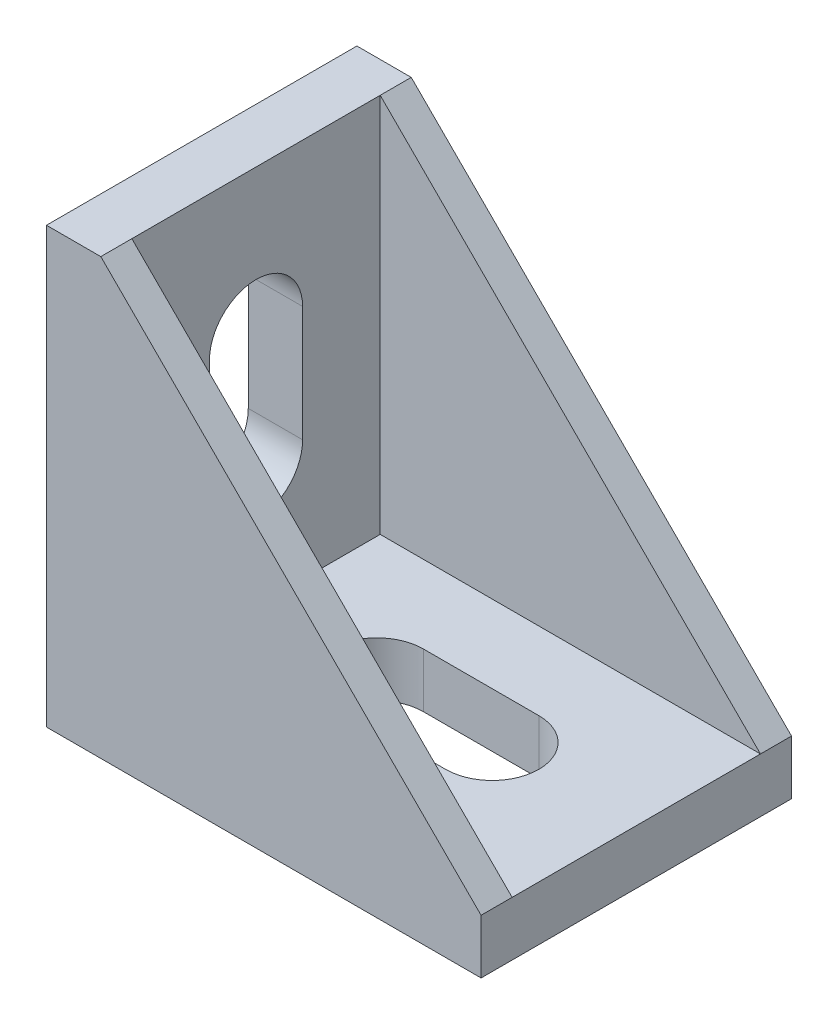
ISO-10303-21;
HEADER;
FILE_DESCRIPTION(('STEP AP214'),'2;1');
FILE_NAME('part.step','',(''),(''),'','','');
FILE_SCHEMA(('AUTOMOTIVE_DESIGN { 1 0 10303 214 1 1 1 1 }'));
ENDSEC;
DATA;
#1=APPLICATION_CONTEXT('core data for automotive mechanical design processes');
#2=APPLICATION_PROTOCOL_DEFINITION('international standard','automotive_design',2000,#1);
#3=PRODUCT_CONTEXT('',#1,'mechanical');
#4=PRODUCT('Part','Part','',(#3));
#5=PRODUCT_RELATED_PRODUCT_CATEGORY('part','',(#4));
#6=PRODUCT_DEFINITION_FORMATION('','',#4);
#7=PRODUCT_DEFINITION_CONTEXT('part definition',#1,'design');
#8=PRODUCT_DEFINITION('design','',#6,#7);
#9=PRODUCT_DEFINITION_SHAPE('','',#8);
#10=(LENGTH_UNIT() NAMED_UNIT(*) SI_UNIT(.MILLI.,.METRE.));
#11=(NAMED_UNIT(*) PLANE_ANGLE_UNIT() SI_UNIT($,.RADIAN.));
#12=(NAMED_UNIT(*) SI_UNIT($,.STERADIAN.) SOLID_ANGLE_UNIT());
#13=UNCERTAINTY_MEASURE_WITH_UNIT(LENGTH_MEASURE(1.E-05),#10,'distance_accuracy_value','');
#14=(GEOMETRIC_REPRESENTATION_CONTEXT(3) GLOBAL_UNCERTAINTY_ASSIGNED_CONTEXT((#13)) GLOBAL_UNIT_ASSIGNED_CONTEXT((#10,
#11,#12)) REPRESENTATION_CONTEXT('',''));
#15=CARTESIAN_POINT('',(0.,0.,0.));
#16=DIRECTION('',(0.,0.,1.));
#17=DIRECTION('',(1.,0.,0.));
#18=AXIS2_PLACEMENT_3D('',#15,#16,#17);
#19=CARTESIAN_POINT('',(3.5,0.,0.));
#20=DIRECTION('',(-1.,0.,0.));
#21=DIRECTION('',(0.,0.,1.));
#22=AXIS2_PLACEMENT_3D('',#19,#20,#21);
#23=PLANE('',#22);
#24=DIRECTION('',(0.,1.,0.));
#25=VECTOR('',#24,1.);
#26=CARTESIAN_POINT('',(3.5,11.28,-13.));
#27=LINE('',#26,#25);
#28=CARTESIAN_POINT('',(3.5,11.28,-13.));
#29=VERTEX_POINT('',#28);
#30=CARTESIAN_POINT('',(3.5,18.72,-13.));
#31=VERTEX_POINT('',#30);
#32=EDGE_CURVE('E173',#29,#31,#27,.T.);
#33=ORIENTED_EDGE('',*,*,#32,.F.);
#34=CARTESIAN_POINT('',(3.5,11.28,-10.));
#35=DIRECTION('',(1.,0.,0.));
#36=DIRECTION('',(0.,0.,-1.));
#37=AXIS2_PLACEMENT_3D('',#34,#35,#36);
#38=CIRCLE('',#37,3.);
#39=CARTESIAN_POINT('',(3.5,11.28,-7.));
#40=VERTEX_POINT('',#39);
#41=EDGE_CURVE('E48',#40,#29,#38,.T.);
#42=ORIENTED_EDGE('',*,*,#41,.F.);
#43=DIRECTION('',(0.,-1.,0.));
#44=VECTOR('',#43,1.);
#45=CARTESIAN_POINT('',(3.5,11.28,-7.));
#46=LINE('',#45,#44);
#47=CARTESIAN_POINT('',(3.5,18.72,-7.));
#48=VERTEX_POINT('',#47);
#49=EDGE_CURVE('E164',#48,#40,#46,.T.);
#50=ORIENTED_EDGE('',*,*,#49,.F.);
#51=CARTESIAN_POINT('',(3.5,18.72,-10.));
#52=DIRECTION('',(1.,0.,0.));
#53=DIRECTION('',(0.,0.,-1.));
#54=AXIS2_PLACEMENT_3D('',#51,#52,#53);
#55=CIRCLE('',#54,3.);
#56=EDGE_CURVE('E167',#31,#48,#55,.T.);
#57=ORIENTED_EDGE('',*,*,#56,.F.);
#58=EDGE_LOOP('',(#33,#42,#50,#57));
#59=FACE_BOUND('',#58,.T.);
#60=DIRECTION('',(0.,1.,0.));
#61=VECTOR('',#60,1.);
#62=CARTESIAN_POINT('',(3.5,0.,-2.));
#63=LINE('',#62,#61);
#64=CARTESIAN_POINT('',(3.5,3.5,-2.));
#65=VERTEX_POINT('',#64);
#66=CARTESIAN_POINT('',(3.5,28.,-2.));
#67=VERTEX_POINT('',#66);
#68=EDGE_CURVE('E227',#65,#67,#63,.T.);
#69=ORIENTED_EDGE('',*,*,#68,.F.);
#70=DIRECTION('',(0.,0.,1.));
#71=VECTOR('',#70,1.);
#72=CARTESIAN_POINT('',(3.5,3.5,0.));
#73=LINE('',#72,#71);
#74=CARTESIAN_POINT('',(3.5,3.5,-18.));
#75=VERTEX_POINT('',#74);
#76=EDGE_CURVE('E240',#75,#65,#73,.T.);
#77=ORIENTED_EDGE('',*,*,#76,.F.);
#78=DIRECTION('',(0.,1.,0.));
#79=VECTOR('',#78,1.);
#80=CARTESIAN_POINT('',(3.5,0.,-18.));
#81=LINE('',#80,#79);
#82=CARTESIAN_POINT('',(3.5,28.,-18.));
#83=VERTEX_POINT('',#82);
#84=EDGE_CURVE('E237',#75,#83,#81,.T.);
#85=ORIENTED_EDGE('',*,*,#84,.T.);
#86=DIRECTION('',(0.,0.,1.));
#87=VECTOR('',#86,1.);
#88=CARTESIAN_POINT('',(3.5,28.,0.));
#89=LINE('',#88,#87);
#90=EDGE_CURVE('E259',#83,#67,#89,.T.);
#91=ORIENTED_EDGE('',*,*,#90,.T.);
#92=EDGE_LOOP('',(#69,#77,#85,#91));
#93=FACE_BOUND('',#92,.T.);
#94=ADVANCED_FACE('F33',(#59,#93),#23,.F.);
#95=CARTESIAN_POINT('',(28.,3.5,0.));
#96=DIRECTION('',(0.,-1.,0.));
#97=DIRECTION('',(0.,0.,-1.));
#98=AXIS2_PLACEMENT_3D('',#95,#96,#97);
#99=PLANE('',#98);
#100=DIRECTION('',(-1.,0.,0.));
#101=VECTOR('',#100,1.);
#102=CARTESIAN_POINT('',(18.7187827127262,3.5,-13.));
#103=LINE('',#102,#101);
#104=CARTESIAN_POINT('',(18.7187827127262,3.5,-13.));
#105=VERTEX_POINT('',#104);
#106=CARTESIAN_POINT('',(11.2812172872738,3.5,-13.));
#107=VERTEX_POINT('',#106);
#108=EDGE_CURVE('E198',#105,#107,#103,.T.);
#109=ORIENTED_EDGE('',*,*,#108,.F.);
#110=CARTESIAN_POINT('',(18.7187827127262,3.5,-10.));
#111=DIRECTION('',(0.,1.,0.));
#112=DIRECTION('',(0.,0.,1.));
#113=AXIS2_PLACEMENT_3D('',#110,#111,#112);
#114=CIRCLE('',#113,3.);
#115=CARTESIAN_POINT('',(18.7187827127262,3.5,-7.00000000000001));
#116=VERTEX_POINT('',#115);
#117=EDGE_CURVE('E179',#116,#105,#114,.T.);
#118=ORIENTED_EDGE('',*,*,#117,.F.);
#119=DIRECTION('',(1.,0.,0.));
#120=VECTOR('',#119,1.);
#121=CARTESIAN_POINT('',(18.7187827127262,3.5,-7.00000000000001));
#122=LINE('',#121,#120);
#123=CARTESIAN_POINT('',(11.2812172872738,3.5,-7.));
#124=VERTEX_POINT('',#123);
#125=EDGE_CURVE('E187',#124,#116,#122,.T.);
#126=ORIENTED_EDGE('',*,*,#125,.F.);
#127=CARTESIAN_POINT('',(11.2812172872738,3.5,-10.));
#128=DIRECTION('',(0.,1.,0.));
#129=DIRECTION('',(0.,0.,1.));
#130=AXIS2_PLACEMENT_3D('',#127,#128,#129);
#131=CIRCLE('',#130,3.);
#132=EDGE_CURVE('E201',#107,#124,#131,.T.);
#133=ORIENTED_EDGE('',*,*,#132,.F.);
#134=EDGE_LOOP('',(#109,#118,#126,#133));
#135=FACE_BOUND('',#134,.T.);
#136=DIRECTION('',(-1.,0.,0.));
#137=VECTOR('',#136,1.);
#138=CARTESIAN_POINT('',(28.,3.5,-2.));
#139=LINE('',#138,#137);
#140=CARTESIAN_POINT('',(28.,3.5,-2.));
#141=VERTEX_POINT('',#140);
#142=EDGE_CURVE('E223',#141,#65,#139,.T.);
#143=ORIENTED_EDGE('',*,*,#142,.F.);
#144=DIRECTION('',(0.,0.,1.));
#145=VECTOR('',#144,1.);
#146=CARTESIAN_POINT('',(28.,3.5,0.));
#147=LINE('',#146,#145);
#148=CARTESIAN_POINT('',(28.,3.5,-18.));
#149=VERTEX_POINT('',#148);
#150=EDGE_CURVE('E249',#149,#141,#147,.T.);
#151=ORIENTED_EDGE('',*,*,#150,.F.);
#152=DIRECTION('',(-1.,0.,0.));
#153=VECTOR('',#152,1.);
#154=CARTESIAN_POINT('',(28.,3.5,-18.));
#155=LINE('',#154,#153);
#156=EDGE_CURVE('E232',#149,#75,#155,.T.);
#157=ORIENTED_EDGE('',*,*,#156,.T.);
#158=ORIENTED_EDGE('',*,*,#76,.T.);
#159=EDGE_LOOP('',(#143,#151,#157,#158));
#160=FACE_BOUND('',#159,.T.);
#161=ADVANCED_FACE('F299',(#135,#160),#99,.F.);
#162=CARTESIAN_POINT('',(3.5,0.,0.));
#163=DIRECTION('',(0.,0.,-1.));
#164=DIRECTION('',(-1.,0.,0.));
#165=AXIS2_PLACEMENT_3D('',#162,#163,#164);
#166=PLANE('',#165);
#167=DIRECTION('',(0.,-1.,0.));
#168=VECTOR('',#167,1.);
#169=CARTESIAN_POINT('',(0.,0.,0.));
#170=LINE('',#169,#168);
#171=CARTESIAN_POINT('',(0.,28.,0.));
#172=VERTEX_POINT('',#171);
#173=CARTESIAN_POINT('',(0.,0.,0.));
#174=VERTEX_POINT('',#173);
#175=EDGE_CURVE('E253',#172,#174,#170,.T.);
#176=ORIENTED_EDGE('',*,*,#175,.T.);
#177=DIRECTION('',(-1.,0.,0.));
#178=VECTOR('',#177,1.);
#179=CARTESIAN_POINT('',(3.5,0.,0.));
#180=LINE('',#179,#178);
#181=CARTESIAN_POINT('',(28.,0.,0.));
#182=VERTEX_POINT('',#181);
#183=EDGE_CURVE('E11',#182,#174,#180,.T.);
#184=ORIENTED_EDGE('',*,*,#183,.F.);
#185=DIRECTION('',(0.,-1.,0.));
#186=VECTOR('',#185,1.);
#187=CARTESIAN_POINT('',(28.,0.,0.));
#188=LINE('',#187,#186);
#189=CARTESIAN_POINT('',(28.,3.5,0.));
#190=VERTEX_POINT('',#189);
#191=EDGE_CURVE('E241',#190,#182,#188,.T.);
#192=ORIENTED_EDGE('',*,*,#191,.F.);
#193=DIRECTION('',(-0.707106781186547,0.707106781186547,0.));
#194=VECTOR('',#193,1.);
#195=CARTESIAN_POINT('',(28.,3.5,0.));
#196=LINE('',#195,#194);
#197=CARTESIAN_POINT('',(3.5,28.,0.));
#198=VERTEX_POINT('',#197);
#199=EDGE_CURVE('E208',#190,#198,#196,.T.);
#200=ORIENTED_EDGE('',*,*,#199,.T.);
#201=DIRECTION('',(-1.,0.,0.));
#202=VECTOR('',#201,1.);
#203=CARTESIAN_POINT('',(3.5,28.,0.));
#204=LINE('',#203,#202);
#205=EDGE_CURVE('E258',#198,#172,#204,.T.);
#206=ORIENTED_EDGE('',*,*,#205,.T.);
#207=EDGE_LOOP('',(#176,#184,#192,#200,#206));
#208=FACE_BOUND('',#207,.T.);
#209=ADVANCED_FACE('F35',(#208),#166,.F.);
#210=CARTESIAN_POINT('',(3.5,0.,0.));
#211=DIRECTION('',(0.,1.,0.));
#212=DIRECTION('',(0.,0.,1.));
#213=AXIS2_PLACEMENT_3D('',#210,#211,#212);
#214=PLANE('',#213);
#215=DIRECTION('',(1.,0.,0.));
#216=VECTOR('',#215,1.);
#217=CARTESIAN_POINT('',(18.7187827127262,0.,-7.00000000000001));
#218=LINE('',#217,#216);
#219=CARTESIAN_POINT('',(11.2812172872738,0.,-7.));
#220=VERTEX_POINT('',#219);
#221=CARTESIAN_POINT('',(18.7187827127262,0.,-7.00000000000001));
#222=VERTEX_POINT('',#221);
#223=EDGE_CURVE('E193',#220,#222,#218,.T.);
#224=ORIENTED_EDGE('',*,*,#223,.T.);
#225=CARTESIAN_POINT('',(18.7187827127262,0.,-10.));
#226=DIRECTION('',(0.,1.,0.));
#227=DIRECTION('',(0.,0.,1.));
#228=AXIS2_PLACEMENT_3D('',#225,#226,#227);
#229=CIRCLE('',#228,3.);
#230=CARTESIAN_POINT('',(18.7187827127262,0.,-13.));
#231=VERTEX_POINT('',#230);
#232=EDGE_CURVE('E183',#222,#231,#229,.T.);
#233=ORIENTED_EDGE('',*,*,#232,.T.);
#234=DIRECTION('',(-1.,0.,0.));
#235=VECTOR('',#234,1.);
#236=CARTESIAN_POINT('',(18.7187827127262,0.,-13.));
#237=LINE('',#236,#235);
#238=CARTESIAN_POINT('',(11.2812172872738,0.,-13.));
#239=VERTEX_POINT('',#238);
#240=EDGE_CURVE('E186',#231,#239,#237,.T.);
#241=ORIENTED_EDGE('',*,*,#240,.T.);
#242=CARTESIAN_POINT('',(11.2812172872738,0.,-10.));
#243=DIRECTION('',(0.,1.,0.));
#244=DIRECTION('',(0.,0.,1.));
#245=AXIS2_PLACEMENT_3D('',#242,#243,#244);
#246=CIRCLE('',#245,3.);
#247=EDGE_CURVE('E190',#239,#220,#246,.T.);
#248=ORIENTED_EDGE('',*,*,#247,.T.);
#249=EDGE_LOOP('',(#224,#233,#241,#248));
#250=FACE_BOUND('',#249,.T.);
#251=DIRECTION('',(0.,0.,-1.));
#252=VECTOR('',#251,1.);
#253=CARTESIAN_POINT('',(0.,0.,0.));
#254=LINE('',#253,#252);
#255=CARTESIAN_POINT('',(0.,0.,-20.));
#256=VERTEX_POINT('',#255);
#257=EDGE_CURVE('E262',#174,#256,#254,.T.);
#258=ORIENTED_EDGE('',*,*,#257,.T.);
#259=DIRECTION('',(-1.,0.,0.));
#260=VECTOR('',#259,1.);
#261=CARTESIAN_POINT('',(3.5,0.,-20.));
#262=LINE('',#261,#260);
#263=CARTESIAN_POINT('',(28.,0.,-20.));
#264=VERTEX_POINT('',#263);
#265=EDGE_CURVE('E41',#264,#256,#262,.T.);
#266=ORIENTED_EDGE('',*,*,#265,.F.);
#267=DIRECTION('',(0.,0.,-1.));
#268=VECTOR('',#267,1.);
#269=CARTESIAN_POINT('',(28.,0.,0.));
#270=LINE('',#269,#268);
#271=EDGE_CURVE('E244',#182,#264,#270,.T.);
#272=ORIENTED_EDGE('',*,*,#271,.F.);
#273=ORIENTED_EDGE('',*,*,#183,.T.);
#274=EDGE_LOOP('',(#258,#266,#272,#273));
#275=FACE_BOUND('',#274,.T.);
#276=ADVANCED_FACE('F336',(#250,#275),#214,.F.);
#277=CARTESIAN_POINT('',(3.5,0.,-20.));
#278=DIRECTION('',(0.,0.,1.));
#279=DIRECTION('',(1.,0.,0.));
#280=AXIS2_PLACEMENT_3D('',#277,#278,#279);
#281=PLANE('',#280);
#282=DIRECTION('',(-1.,0.,0.));
#283=VECTOR('',#282,1.);
#284=CARTESIAN_POINT('',(3.5,28.,-20.));
#285=LINE('',#284,#283);
#286=CARTESIAN_POINT('',(3.5,28.,-20.));
#287=VERTEX_POINT('',#286);
#288=CARTESIAN_POINT('',(0.,28.,-20.));
#289=VERTEX_POINT('',#288);
#290=EDGE_CURVE('E270',#287,#289,#285,.T.);
#291=ORIENTED_EDGE('',*,*,#290,.F.);
#292=DIRECTION('',(0.707106781186547,-0.707106781186547,0.));
#293=VECTOR('',#292,1.);
#294=CARTESIAN_POINT('',(28.,3.5,-20.));
#295=LINE('',#294,#293);
#296=CARTESIAN_POINT('',(28.,3.5,-20.));
#297=VERTEX_POINT('',#296);
#298=EDGE_CURVE('E229',#287,#297,#295,.T.);
#299=ORIENTED_EDGE('',*,*,#298,.T.);
#300=DIRECTION('',(0.,1.,0.));
#301=VECTOR('',#300,1.);
#302=CARTESIAN_POINT('',(28.,0.,-20.));
#303=LINE('',#302,#301);
#304=EDGE_CURVE('E246',#264,#297,#303,.T.);
#305=ORIENTED_EDGE('',*,*,#304,.F.);
#306=ORIENTED_EDGE('',*,*,#265,.T.);
#307=DIRECTION('',(0.,1.,0.));
#308=VECTOR('',#307,1.);
#309=CARTESIAN_POINT('',(0.,0.,-20.));
#310=LINE('',#309,#308);
#311=EDGE_CURVE('E264',#256,#289,#310,.T.);
#312=ORIENTED_EDGE('',*,*,#311,.T.);
#313=EDGE_LOOP('',(#291,#299,#305,#306,#312));
#314=FACE_BOUND('',#313,.T.);
#315=ADVANCED_FACE('F278',(#314),#281,.F.);
#316=CARTESIAN_POINT('',(3.5,28.,0.));
#317=DIRECTION('',(0.,-1.,0.));
#318=DIRECTION('',(0.,0.,-1.));
#319=AXIS2_PLACEMENT_3D('',#316,#317,#318);
#320=PLANE('',#319);
#321=DIRECTION('',(0.,0.,1.));
#322=VECTOR('',#321,1.);
#323=CARTESIAN_POINT('',(3.5,28.,-2.));
#324=LINE('',#323,#322);
#325=EDGE_CURVE('E221',#67,#198,#324,.T.);
#326=ORIENTED_EDGE('',*,*,#325,.F.);
#327=ORIENTED_EDGE('',*,*,#90,.F.);
#328=EDGE_CURVE('E256',#287,#83,#89,.T.);
#329=ORIENTED_EDGE('',*,*,#328,.F.);
#330=ORIENTED_EDGE('',*,*,#290,.T.);
#331=DIRECTION('',(0.,0.,1.));
#332=VECTOR('',#331,1.);
#333=CARTESIAN_POINT('',(0.,28.,0.));
#334=LINE('',#333,#332);
#335=EDGE_CURVE('E266',#289,#172,#334,.T.);
#336=ORIENTED_EDGE('',*,*,#335,.T.);
#337=ORIENTED_EDGE('',*,*,#205,.F.);
#338=EDGE_LOOP('',(#326,#327,#329,#330,#336,#337));
#339=FACE_BOUND('',#338,.T.);
#340=ADVANCED_FACE('F286',(#339),#320,.F.);
#341=CARTESIAN_POINT('',(0.,0.,0.));
#342=DIRECTION('',(-1.,0.,0.));
#343=DIRECTION('',(0.,0.,1.));
#344=AXIS2_PLACEMENT_3D('',#341,#342,#343);
#345=PLANE('',#344);
#346=CARTESIAN_POINT('',(0.,11.28,-10.));
#347=DIRECTION('',(1.,0.,0.));
#348=DIRECTION('',(0.,0.,-1.));
#349=AXIS2_PLACEMENT_3D('',#346,#347,#348);
#350=CIRCLE('',#349,3.);
#351=CARTESIAN_POINT('',(0.,11.28,-7.));
#352=VERTEX_POINT('',#351);
#353=CARTESIAN_POINT('',(0.,11.28,-13.));
#354=VERTEX_POINT('',#353);
#355=EDGE_CURVE('E148',#352,#354,#350,.T.);
#356=ORIENTED_EDGE('',*,*,#355,.T.);
#357=DIRECTION('',(0.,1.,0.));
#358=VECTOR('',#357,1.);
#359=CARTESIAN_POINT('',(0.,11.28,-13.));
#360=LINE('',#359,#358);
#361=CARTESIAN_POINT('',(0.,18.72,-13.));
#362=VERTEX_POINT('',#361);
#363=EDGE_CURVE('E157',#354,#362,#360,.T.);
#364=ORIENTED_EDGE('',*,*,#363,.T.);
#365=CARTESIAN_POINT('',(0.,18.72,-10.));
#366=DIRECTION('',(1.,0.,0.));
#367=DIRECTION('',(0.,0.,-1.));
#368=AXIS2_PLACEMENT_3D('',#365,#366,#367);
#369=CIRCLE('',#368,3.);
#370=CARTESIAN_POINT('',(0.,18.72,-7.));
#371=VERTEX_POINT('',#370);
#372=EDGE_CURVE('E56',#362,#371,#369,.T.);
#373=ORIENTED_EDGE('',*,*,#372,.T.);
#374=DIRECTION('',(0.,-1.,0.));
#375=VECTOR('',#374,1.);
#376=CARTESIAN_POINT('',(0.,11.28,-7.));
#377=LINE('',#376,#375);
#378=EDGE_CURVE('E154',#371,#352,#377,.T.);
#379=ORIENTED_EDGE('',*,*,#378,.T.);
#380=EDGE_LOOP('',(#356,#364,#373,#379));
#381=FACE_BOUND('',#380,.T.);
#382=ORIENTED_EDGE('',*,*,#175,.F.);
#383=ORIENTED_EDGE('',*,*,#335,.F.);
#384=ORIENTED_EDGE('',*,*,#311,.F.);
#385=ORIENTED_EDGE('',*,*,#257,.F.);
#386=EDGE_LOOP('',(#382,#383,#384,#385));
#387=FACE_BOUND('',#386,.T.);
#388=ADVANCED_FACE('F161',(#381,#387),#345,.T.);
#389=CARTESIAN_POINT('',(28.,0.,0.));
#390=DIRECTION('',(-1.,0.,0.));
#391=DIRECTION('',(0.,0.,1.));
#392=AXIS2_PLACEMENT_3D('',#389,#390,#391);
#393=PLANE('',#392);
#394=ORIENTED_EDGE('',*,*,#271,.T.);
#395=ORIENTED_EDGE('',*,*,#304,.T.);
#396=EDGE_CURVE('E250',#297,#149,#147,.T.);
#397=ORIENTED_EDGE('',*,*,#396,.T.);
#398=ORIENTED_EDGE('',*,*,#150,.T.);
#399=DIRECTION('',(0.,0.,1.));
#400=VECTOR('',#399,1.);
#401=CARTESIAN_POINT('',(28.,3.5,-2.));
#402=LINE('',#401,#400);
#403=EDGE_CURVE('E218',#141,#190,#402,.T.);
#404=ORIENTED_EDGE('',*,*,#403,.T.);
#405=ORIENTED_EDGE('',*,*,#191,.T.);
#406=EDGE_LOOP('',(#394,#395,#397,#398,#404,#405));
#407=FACE_BOUND('',#406,.T.);
#408=ADVANCED_FACE('F295',(#407),#393,.F.);
#409=CARTESIAN_POINT('',(0.,0.,-18.));
#410=DIRECTION('',(0.,0.,1.));
#411=DIRECTION('',(1.,0.,0.));
#412=AXIS2_PLACEMENT_3D('',#409,#410,#411);
#413=PLANE('',#412);
#414=ORIENTED_EDGE('',*,*,#84,.F.);
#415=ORIENTED_EDGE('',*,*,#156,.F.);
#416=DIRECTION('',(0.707106781186547,-0.707106781186547,0.));
#417=VECTOR('',#416,1.);
#418=CARTESIAN_POINT('',(28.,3.5,-18.));
#419=LINE('',#418,#417);
#420=EDGE_CURVE('E230',#83,#149,#419,.T.);
#421=ORIENTED_EDGE('',*,*,#420,.F.);
#422=EDGE_LOOP('',(#414,#415,#421));
#423=FACE_BOUND('',#422,.T.);
#424=ADVANCED_FACE('F312',(#423),#413,.T.);
#425=CARTESIAN_POINT('',(28.,3.5,-18.));
#426=DIRECTION('',(0.707106781186547,0.707106781186547,0.));
#427=DIRECTION('',(-0.707106781186548,0.707106781186548,0.));
#428=AXIS2_PLACEMENT_3D('',#425,#426,#427);
#429=PLANE('',#428);
#430=ORIENTED_EDGE('',*,*,#298,.F.);
#431=ORIENTED_EDGE('',*,*,#328,.T.);
#432=ORIENTED_EDGE('',*,*,#420,.T.);
#433=ORIENTED_EDGE('',*,*,#396,.F.);
#434=EDGE_LOOP('',(#430,#431,#432,#433));
#435=FACE_BOUND('',#434,.T.);
#436=ADVANCED_FACE('F310',(#435),#429,.T.);
#437=CARTESIAN_POINT('',(0.,0.,-2.));
#438=DIRECTION('',(0.,0.,1.));
#439=DIRECTION('',(1.,0.,0.));
#440=AXIS2_PLACEMENT_3D('',#437,#438,#439);
#441=PLANE('',#440);
#442=ORIENTED_EDGE('',*,*,#142,.T.);
#443=ORIENTED_EDGE('',*,*,#68,.T.);
#444=DIRECTION('',(-0.707106781186547,0.707106781186547,0.));
#445=VECTOR('',#444,1.);
#446=CARTESIAN_POINT('',(28.,3.5,-2.));
#447=LINE('',#446,#445);
#448=EDGE_CURVE('E215',#141,#67,#447,.T.);
#449=ORIENTED_EDGE('',*,*,#448,.F.);
#450=EDGE_LOOP('',(#442,#443,#449));
#451=FACE_BOUND('',#450,.T.);
#452=ADVANCED_FACE('F304',(#451),#441,.F.);
#453=CARTESIAN_POINT('',(28.,3.5,-2.));
#454=DIRECTION('',(0.707106781186547,0.707106781186547,0.));
#455=DIRECTION('',(-0.707106781186548,0.707106781186548,0.));
#456=AXIS2_PLACEMENT_3D('',#453,#454,#455);
#457=PLANE('',#456);
#458=ORIENTED_EDGE('',*,*,#199,.F.);
#459=ORIENTED_EDGE('',*,*,#403,.F.);
#460=ORIENTED_EDGE('',*,*,#448,.T.);
#461=ORIENTED_EDGE('',*,*,#325,.T.);
#462=EDGE_LOOP('',(#458,#459,#460,#461));
#463=FACE_BOUND('',#462,.T.);
#464=ADVANCED_FACE('F291',(#463),#457,.T.);
#465=CARTESIAN_POINT('',(18.7187827127262,0.,-10.));
#466=DIRECTION('',(0.,1.,0.));
#467=DIRECTION('',(0.,0.,1.));
#468=AXIS2_PLACEMENT_3D('',#465,#466,#467);
#469=CYLINDRICAL_SURFACE('',#468,3.);
#470=ORIENTED_EDGE('',*,*,#117,.T.);
#471=DIRECTION('',(0.,1.,0.));
#472=VECTOR('',#471,1.);
#473=CARTESIAN_POINT('',(18.7187827127262,0.,-13.));
#474=LINE('',#473,#472);
#475=EDGE_CURVE('E196',#231,#105,#474,.T.);
#476=ORIENTED_EDGE('',*,*,#475,.F.);
#477=ORIENTED_EDGE('',*,*,#232,.F.);
#478=DIRECTION('',(0.,1.,0.));
#479=VECTOR('',#478,1.);
#480=CARTESIAN_POINT('',(18.7187827127262,0.,-7.00000000000001));
#481=LINE('',#480,#479);
#482=EDGE_CURVE('E206',#222,#116,#481,.T.);
#483=ORIENTED_EDGE('',*,*,#482,.T.);
#484=EDGE_LOOP('',(#470,#476,#477,#483));
#485=FACE_BOUND('',#484,.T.);
#486=ADVANCED_FACE('F349',(#485),#469,.F.);
#487=CARTESIAN_POINT('',(18.7187827127262,0.,-7.00000000000001));
#488=DIRECTION('',(0.,0.,1.));
#489=DIRECTION('',(1.,0.,0.));
#490=AXIS2_PLACEMENT_3D('',#487,#488,#489);
#491=PLANE('',#490);
#492=ORIENTED_EDGE('',*,*,#125,.T.);
#493=ORIENTED_EDGE('',*,*,#482,.F.);
#494=ORIENTED_EDGE('',*,*,#223,.F.);
#495=DIRECTION('',(0.,1.,0.));
#496=VECTOR('',#495,1.);
#497=CARTESIAN_POINT('',(11.2812172872738,0.,-7.));
#498=LINE('',#497,#496);
#499=EDGE_CURVE('E209',#220,#124,#498,.T.);
#500=ORIENTED_EDGE('',*,*,#499,.T.);
#501=EDGE_LOOP('',(#492,#493,#494,#500));
#502=FACE_BOUND('',#501,.T.);
#503=ADVANCED_FACE('F345',(#502),#491,.F.);
#504=CARTESIAN_POINT('',(11.2812172872738,0.,-10.));
#505=DIRECTION('',(0.,1.,0.));
#506=DIRECTION('',(0.,0.,1.));
#507=AXIS2_PLACEMENT_3D('',#504,#505,#506);
#508=CYLINDRICAL_SURFACE('',#507,3.);
#509=ORIENTED_EDGE('',*,*,#132,.T.);
#510=ORIENTED_EDGE('',*,*,#499,.F.);
#511=ORIENTED_EDGE('',*,*,#247,.F.);
#512=DIRECTION('',(0.,1.,0.));
#513=VECTOR('',#512,1.);
#514=CARTESIAN_POINT('',(11.2812172872738,0.,-13.));
#515=LINE('',#514,#513);
#516=EDGE_CURVE('E211',#239,#107,#515,.T.);
#517=ORIENTED_EDGE('',*,*,#516,.T.);
#518=EDGE_LOOP('',(#509,#510,#511,#517));
#519=FACE_BOUND('',#518,.T.);
#520=ADVANCED_FACE('F357',(#519),#508,.F.);
#521=CARTESIAN_POINT('',(18.7187827127262,0.,-13.));
#522=DIRECTION('',(0.,0.,-1.));
#523=DIRECTION('',(-1.,0.,0.));
#524=AXIS2_PLACEMENT_3D('',#521,#522,#523);
#525=PLANE('',#524);
#526=ORIENTED_EDGE('',*,*,#108,.T.);
#527=ORIENTED_EDGE('',*,*,#516,.F.);
#528=ORIENTED_EDGE('',*,*,#240,.F.);
#529=ORIENTED_EDGE('',*,*,#475,.T.);
#530=EDGE_LOOP('',(#526,#527,#528,#529));
#531=FACE_BOUND('',#530,.T.);
#532=ADVANCED_FACE('F354',(#531),#525,.F.);
#533=CARTESIAN_POINT('',(0.,11.28,-10.));
#534=DIRECTION('',(1.,0.,0.));
#535=DIRECTION('',(0.,0.,-1.));
#536=AXIS2_PLACEMENT_3D('',#533,#534,#535);
#537=CYLINDRICAL_SURFACE('',#536,3.);
#538=ORIENTED_EDGE('',*,*,#41,.T.);
#539=DIRECTION('',(1.,0.,0.));
#540=VECTOR('',#539,1.);
#541=CARTESIAN_POINT('',(0.,11.28,-13.));
#542=LINE('',#541,#540);
#543=EDGE_CURVE('E144',#354,#29,#542,.T.);
#544=ORIENTED_EDGE('',*,*,#543,.F.);
#545=ORIENTED_EDGE('',*,*,#355,.F.);
#546=DIRECTION('',(1.,0.,0.));
#547=VECTOR('',#546,1.);
#548=CARTESIAN_POINT('',(0.,11.28,-7.));
#549=LINE('',#548,#547);
#550=EDGE_CURVE('E177',#352,#40,#549,.T.);
#551=ORIENTED_EDGE('',*,*,#550,.T.);
#552=EDGE_LOOP('',(#538,#544,#545,#551));
#553=FACE_BOUND('',#552,.T.);
#554=ADVANCED_FACE('F146',(#553),#537,.F.);
#555=CARTESIAN_POINT('',(0.,11.28,-7.));
#556=DIRECTION('',(0.,0.,1.));
#557=DIRECTION('',(0.,-1.,0.));
#558=AXIS2_PLACEMENT_3D('',#555,#556,#557);
#559=PLANE('',#558);
#560=ORIENTED_EDGE('',*,*,#49,.T.);
#561=ORIENTED_EDGE('',*,*,#550,.F.);
#562=ORIENTED_EDGE('',*,*,#378,.F.);
#563=DIRECTION('',(1.,0.,0.));
#564=VECTOR('',#563,1.);
#565=CARTESIAN_POINT('',(0.,18.72,-7.));
#566=LINE('',#565,#564);
#567=EDGE_CURVE('E180',#371,#48,#566,.T.);
#568=ORIENTED_EDGE('',*,*,#567,.T.);
#569=EDGE_LOOP('',(#560,#561,#562,#568));
#570=FACE_BOUND('',#569,.T.);
#571=ADVANCED_FACE('F418',(#570),#559,.F.);
#572=CARTESIAN_POINT('',(0.,18.72,-10.));
#573=DIRECTION('',(1.,0.,0.));
#574=DIRECTION('',(0.,0.,-1.));
#575=AXIS2_PLACEMENT_3D('',#572,#573,#574);
#576=CYLINDRICAL_SURFACE('',#575,3.);
#577=ORIENTED_EDGE('',*,*,#56,.T.);
#578=ORIENTED_EDGE('',*,*,#567,.F.);
#579=ORIENTED_EDGE('',*,*,#372,.F.);
#580=DIRECTION('',(1.,0.,0.));
#581=VECTOR('',#580,1.);
#582=CARTESIAN_POINT('',(0.,18.72,-13.));
#583=LINE('',#582,#581);
#584=EDGE_CURVE('E153',#362,#31,#583,.T.);
#585=ORIENTED_EDGE('',*,*,#584,.T.);
#586=EDGE_LOOP('',(#577,#578,#579,#585));
#587=FACE_BOUND('',#586,.T.);
#588=ADVANCED_FACE('F426',(#587),#576,.F.);
#589=CARTESIAN_POINT('',(0.,11.28,-13.));
#590=DIRECTION('',(0.,0.,-1.));
#591=DIRECTION('',(-1.,0.,0.));
#592=AXIS2_PLACEMENT_3D('',#589,#590,#591);
#593=PLANE('',#592);
#594=ORIENTED_EDGE('',*,*,#32,.T.);
#595=ORIENTED_EDGE('',*,*,#584,.F.);
#596=ORIENTED_EDGE('',*,*,#363,.F.);
#597=ORIENTED_EDGE('',*,*,#543,.T.);
#598=EDGE_LOOP('',(#594,#595,#596,#597));
#599=FACE_BOUND('',#598,.T.);
#600=ADVANCED_FACE('F158',(#599),#593,.F.);
#601=CLOSED_SHELL('',(#94,#161,#209,#276,#315,#340,#388,#408,#424,#436,#452,#464,#486,#503,#520,
#532,#554,#571,#588,#600));
#602=MANIFOLD_SOLID_BREP('B2',#601);
#603=ADVANCED_BREP_SHAPE_REPRESENTATION('',(#18,#602),#14);
#604=SHAPE_DEFINITION_REPRESENTATION(#9,#603);
ENDSEC;
END-ISO-10303-21;
